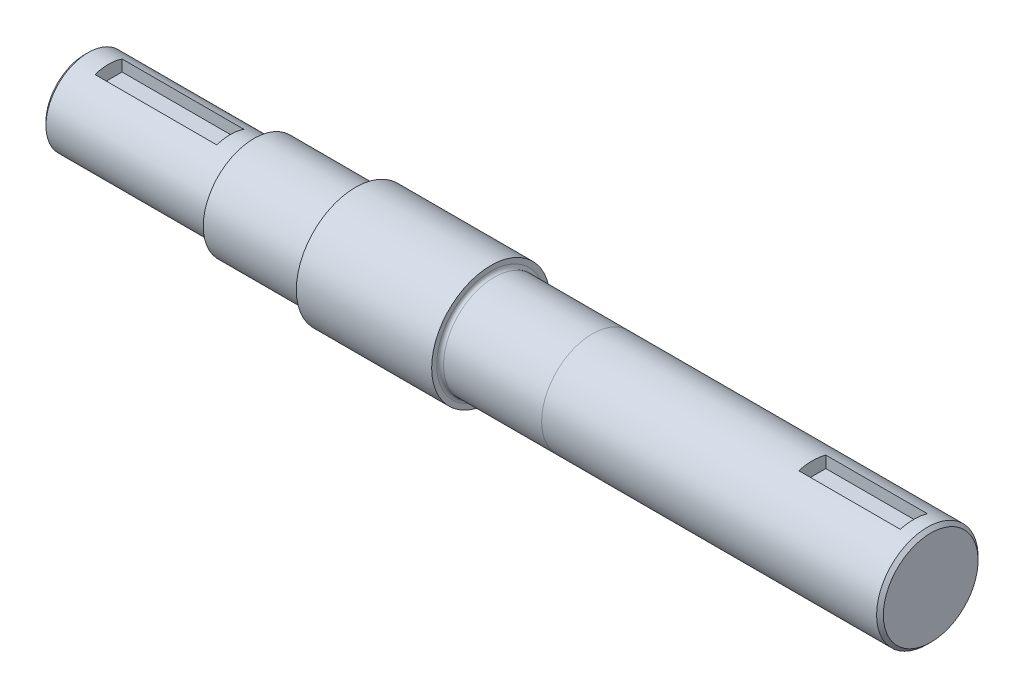
ISO-10303-21;
HEADER;
FILE_DESCRIPTION(('STEP AP214'),'2;1');
FILE_NAME('part.step','',(''),(''),'','','');
FILE_SCHEMA(('AUTOMOTIVE_DESIGN { 1 0 10303 214 1 1 1 1 }'));
ENDSEC;
DATA;
#1=APPLICATION_CONTEXT('core data for automotive mechanical design processes');
#2=APPLICATION_PROTOCOL_DEFINITION('international standard','automotive_design',2000,#1);
#3=PRODUCT_CONTEXT('',#1,'mechanical');
#4=PRODUCT('Part','Part','',(#3));
#5=PRODUCT_RELATED_PRODUCT_CATEGORY('part','',(#4));
#6=PRODUCT_DEFINITION_FORMATION('','',#4);
#7=PRODUCT_DEFINITION_CONTEXT('part definition',#1,'design');
#8=PRODUCT_DEFINITION('design','',#6,#7);
#9=PRODUCT_DEFINITION_SHAPE('','',#8);
#10=(LENGTH_UNIT() NAMED_UNIT(*) SI_UNIT(.MILLI.,.METRE.));
#11=(NAMED_UNIT(*) PLANE_ANGLE_UNIT() SI_UNIT($,.RADIAN.));
#12=(NAMED_UNIT(*) SI_UNIT($,.STERADIAN.) SOLID_ANGLE_UNIT());
#13=UNCERTAINTY_MEASURE_WITH_UNIT(LENGTH_MEASURE(1.E-05),#10,'distance_accuracy_value','');
#14=(GEOMETRIC_REPRESENTATION_CONTEXT(3) GLOBAL_UNCERTAINTY_ASSIGNED_CONTEXT((#13)) GLOBAL_UNIT_ASSIGNED_CONTEXT((#10,
#11,#12)) REPRESENTATION_CONTEXT('',''));
#15=CARTESIAN_POINT('',(0.,0.,0.));
#16=DIRECTION('',(0.,0.,1.));
#17=DIRECTION('',(1.,0.,0.));
#18=AXIS2_PLACEMENT_3D('',#15,#16,#17);
#19=CARTESIAN_POINT('',(0.,0.,0.));
#20=DIRECTION('',(-1.,0.,0.));
#21=DIRECTION('',(0.,0.,1.));
#22=AXIS2_PLACEMENT_3D('',#19,#20,#21);
#23=CYLINDRICAL_SURFACE('',#22,15.);
#24=CARTESIAN_POINT('',(245.,0.,0.));
#25=DIRECTION('',(-1.,0.,0.));
#26=DIRECTION('',(0.,0.,1.));
#27=AXIS2_PLACEMENT_3D('',#24,#25,#26);
#28=CIRCLE('',#27,15.);
#29=CARTESIAN_POINT('',(245.,14.456832294801,4.));
#30=VERTEX_POINT('',#29);
#31=CARTESIAN_POINT('',(245.,14.456832294801,-4.));
#32=VERTEX_POINT('',#31);
#33=EDGE_CURVE('E116',#30,#32,#28,.T.);
#34=ORIENTED_EDGE('',*,*,#33,.F.);
#35=DIRECTION('',(-1.,0.,0.));
#36=VECTOR('',#35,1.);
#37=CARTESIAN_POINT('',(0.,14.456832294801,4.00000000000001));
#38=LINE('',#37,#36);
#39=CARTESIAN_POINT('',(215.,14.456832294801,4.00000000000001));
#40=VERTEX_POINT('',#39);
#41=EDGE_CURVE('E180',#40,#30,#38,.F.);
#42=ORIENTED_EDGE('',*,*,#41,.F.);
#43=CARTESIAN_POINT('',(215.,0.,0.));
#44=DIRECTION('',(1.,0.,0.));
#45=DIRECTION('',(0.,0.,-1.));
#46=AXIS2_PLACEMENT_3D('',#43,#44,#45);
#47=CIRCLE('',#46,15.);
#48=CARTESIAN_POINT('',(215.,14.456832294801,-4.));
#49=VERTEX_POINT('',#48);
#50=EDGE_CURVE('E182',#49,#40,#47,.T.);
#51=ORIENTED_EDGE('',*,*,#50,.F.);
#52=DIRECTION('',(-1.,0.,0.));
#53=VECTOR('',#52,1.);
#54=CARTESIAN_POINT('',(0.,14.456832294801,-4.00000000000002));
#55=LINE('',#54,#53);
#56=EDGE_CURVE('E181',#32,#49,#55,.T.);
#57=ORIENTED_EDGE('',*,*,#56,.F.);
#58=EDGE_LOOP('',(#34,#42,#51,#57));
#59=FACE_BOUND('',#58,.T.);
#60=CARTESIAN_POINT('',(249.,0.,0.));
#61=DIRECTION('',(-1.,0.,0.));
#62=DIRECTION('',(0.,0.,1.));
#63=AXIS2_PLACEMENT_3D('',#60,#61,#62);
#64=CIRCLE('',#63,15.);
#65=CARTESIAN_POINT('',(249.,0.,15.));
#66=VERTEX_POINT('',#65);
#67=EDGE_CURVE('E209',#66,#66,#64,.T.);
#68=ORIENTED_EDGE('',*,*,#67,.T.);
#69=EDGE_LOOP('',(#68));
#70=FACE_BOUND('',#69,.T.);
#71=CARTESIAN_POINT('',(150.,0.,0.));
#72=DIRECTION('',(1.,0.,0.));
#73=DIRECTION('',(0.,0.,-1.));
#74=AXIS2_PLACEMENT_3D('',#71,#72,#73);
#75=CIRCLE('',#74,15.);
#76=CARTESIAN_POINT('',(150.,0.,-15.));
#77=VERTEX_POINT('',#76);
#78=EDGE_CURVE('E12',#77,#77,#75,.T.);
#79=ORIENTED_EDGE('',*,*,#78,.T.);
#80=EDGE_LOOP('',(#79));
#81=FACE_BOUND('',#80,.T.);
#82=ADVANCED_FACE('F42',(#59,#70,#81),#23,.T.);
#83=ORIENTED_EDGE('',*,*,#78,.F.);
#84=EDGE_LOOP('',(#83));
#85=FACE_BOUND('',#84,.T.);
#86=CARTESIAN_POINT('',(121.,0.,0.));
#87=DIRECTION('',(-1.,0.,0.));
#88=DIRECTION('',(0.,0.,1.));
#89=AXIS2_PLACEMENT_3D('',#86,#87,#88);
#90=CIRCLE('',#89,15.);
#91=CARTESIAN_POINT('',(121.,0.,15.));
#92=VERTEX_POINT('',#91);
#93=EDGE_CURVE('E188',#92,#92,#90,.F.);
#94=ORIENTED_EDGE('',*,*,#93,.T.);
#95=EDGE_LOOP('',(#94));
#96=FACE_BOUND('',#95,.T.);
#97=ADVANCED_FACE('F221',(#85,#96),#23,.T.);
#98=CARTESIAN_POINT('',(0.,0.,0.));
#99=DIRECTION('',(-1.,0.,0.));
#100=DIRECTION('',(0.,0.,1.));
#101=AXIS2_PLACEMENT_3D('',#98,#99,#100);
#102=CYLINDRICAL_SURFACE('',#101,12.5);
#103=CARTESIAN_POINT('',(1.00000000000006,0.,0.));
#104=DIRECTION('',(1.,0.,0.));
#105=DIRECTION('',(0.,0.,-1.));
#106=AXIS2_PLACEMENT_3D('',#103,#104,#105);
#107=CIRCLE('',#106,12.5);
#108=CARTESIAN_POINT('',(1.00000000000006,0.,-12.5));
#109=VERTEX_POINT('',#108);
#110=EDGE_CURVE('E210',#109,#109,#107,.T.);
#111=ORIENTED_EDGE('',*,*,#110,.T.);
#112=EDGE_LOOP('',(#111));
#113=FACE_BOUND('',#112,.T.);
#114=CARTESIAN_POINT('',(49.,0.,0.));
#115=DIRECTION('',(1.,0.,0.));
#116=DIRECTION('',(0.,0.,-1.));
#117=AXIS2_PLACEMENT_3D('',#114,#115,#116);
#118=CIRCLE('',#117,12.5);
#119=CARTESIAN_POINT('',(49.,0.,-12.5));
#120=VERTEX_POINT('',#119);
#121=EDGE_CURVE('E196',#120,#120,#118,.F.);
#122=ORIENTED_EDGE('',*,*,#121,.T.);
#123=EDGE_LOOP('',(#122));
#124=FACE_BOUND('',#123,.T.);
#125=CARTESIAN_POINT('',(7.,0.,0.));
#126=DIRECTION('',(1.,0.,0.));
#127=DIRECTION('',(0.,0.,-1.));
#128=AXIS2_PLACEMENT_3D('',#125,#126,#127);
#129=CIRCLE('',#128,12.5);
#130=CARTESIAN_POINT('',(7.,11.842719282327,-4.));
#131=VERTEX_POINT('',#130);
#132=CARTESIAN_POINT('',(7.,11.842719282327,4.));
#133=VERTEX_POINT('',#132);
#134=EDGE_CURVE('E179',#131,#133,#129,.T.);
#135=ORIENTED_EDGE('',*,*,#134,.F.);
#136=DIRECTION('',(-1.,0.,0.));
#137=VECTOR('',#136,1.);
#138=CARTESIAN_POINT('',(0.,11.842719282327,-4.));
#139=LINE('',#138,#137);
#140=CARTESIAN_POINT('',(43.,11.842719282327,-4.));
#141=VERTEX_POINT('',#140);
#142=EDGE_CURVE('E166',#131,#141,#139,.F.);
#143=ORIENTED_EDGE('',*,*,#142,.T.);
#144=CARTESIAN_POINT('',(43.,0.,0.));
#145=DIRECTION('',(1.,0.,0.));
#146=DIRECTION('',(0.,0.,-1.));
#147=AXIS2_PLACEMENT_3D('',#144,#145,#146);
#148=CIRCLE('',#147,12.5);
#149=CARTESIAN_POINT('',(43.,11.842719282327,4.));
#150=VERTEX_POINT('',#149);
#151=EDGE_CURVE('E171',#141,#150,#148,.T.);
#152=ORIENTED_EDGE('',*,*,#151,.T.);
#153=DIRECTION('',(-1.,0.,0.));
#154=VECTOR('',#153,1.);
#155=CARTESIAN_POINT('',(0.,11.842719282327,4.));
#156=LINE('',#155,#154);
#157=EDGE_CURVE('E172',#133,#150,#156,.F.);
#158=ORIENTED_EDGE('',*,*,#157,.F.);
#159=EDGE_LOOP('',(#135,#143,#152,#158));
#160=FACE_BOUND('',#159,.T.);
#161=ADVANCED_FACE('F233',(#113,#124,#160),#102,.T.);
#162=CARTESIAN_POINT('',(0.,0.,0.));
#163=DIRECTION('',(1.,0.,0.));
#164=DIRECTION('',(0.,0.,-1.));
#165=AXIS2_PLACEMENT_3D('',#162,#163,#164);
#166=PLANE('',#165);
#167=CARTESIAN_POINT('',(0.,0.,0.));
#168=DIRECTION('',(1.,0.,0.));
#169=DIRECTION('',(0.,0.,-1.));
#170=AXIS2_PLACEMENT_3D('',#167,#168,#169);
#171=CIRCLE('',#170,11.5);
#172=CARTESIAN_POINT('',(0.,0.,-11.5));
#173=VERTEX_POINT('',#172);
#174=EDGE_CURVE('E204',#173,#173,#171,.F.);
#175=ORIENTED_EDGE('',*,*,#174,.T.);
#176=EDGE_LOOP('',(#175));
#177=FACE_BOUND('',#176,.T.);
#178=ADVANCED_FACE('F270',(#177),#166,.F.);
#179=CARTESIAN_POINT('',(50.,12.5,0.));
#180=DIRECTION('',(1.,0.,0.));
#181=DIRECTION('',(0.,0.,-1.));
#182=AXIS2_PLACEMENT_3D('',#179,#180,#181);
#183=PLANE('',#182);
#184=CARTESIAN_POINT('',(50.,0.,0.));
#185=DIRECTION('',(1.,0.,0.));
#186=DIRECTION('',(0.,0.,-1.));
#187=AXIS2_PLACEMENT_3D('',#184,#185,#186);
#188=CIRCLE('',#187,13.5);
#189=CARTESIAN_POINT('',(50.,0.,-13.5));
#190=VERTEX_POINT('',#189);
#191=EDGE_CURVE('E203',#190,#190,#188,.T.);
#192=ORIENTED_EDGE('',*,*,#191,.T.);
#193=EDGE_LOOP('',(#192));
#194=FACE_BOUND('',#193,.T.);
#195=CARTESIAN_POINT('',(50.,0.,0.));
#196=DIRECTION('',(-1.,0.,0.));
#197=DIRECTION('',(0.,0.,1.));
#198=AXIS2_PLACEMENT_3D('',#195,#196,#197);
#199=CIRCLE('',#198,15.);
#200=CARTESIAN_POINT('',(50.,0.,15.));
#201=VERTEX_POINT('',#200);
#202=EDGE_CURVE('E167',#201,#201,#199,.T.);
#203=ORIENTED_EDGE('',*,*,#202,.T.);
#204=EDGE_LOOP('',(#203));
#205=FACE_BOUND('',#204,.T.);
#206=ADVANCED_FACE('F263',(#194,#205),#183,.F.);
#207=CARTESIAN_POINT('',(0.,0.,0.));
#208=DIRECTION('',(-1.,0.,0.));
#209=DIRECTION('',(0.,0.,1.));
#210=AXIS2_PLACEMENT_3D('',#207,#208,#209);
#211=CYLINDRICAL_SURFACE('',#210,15.);
#212=CARTESIAN_POINT('',(79.,0.,0.));
#213=DIRECTION('',(1.,0.,0.));
#214=DIRECTION('',(0.,0.,-1.));
#215=AXIS2_PLACEMENT_3D('',#212,#213,#214);
#216=CIRCLE('',#215,15.);
#217=CARTESIAN_POINT('',(79.,0.,-15.));
#218=VERTEX_POINT('',#217);
#219=EDGE_CURVE('E194',#218,#218,#216,.F.);
#220=ORIENTED_EDGE('',*,*,#219,.T.);
#221=EDGE_LOOP('',(#220));
#222=FACE_BOUND('',#221,.T.);
#223=ORIENTED_EDGE('',*,*,#202,.F.);
#224=EDGE_LOOP('',(#223));
#225=FACE_BOUND('',#224,.T.);
#226=ADVANCED_FACE('F258',(#222,#225),#211,.T.);
#227=CARTESIAN_POINT('',(80.,15.,0.));
#228=DIRECTION('',(1.,0.,0.));
#229=DIRECTION('',(0.,0.,-1.));
#230=AXIS2_PLACEMENT_3D('',#227,#228,#229);
#231=PLANE('',#230);
#232=CARTESIAN_POINT('',(80.,0.,0.));
#233=DIRECTION('',(1.,0.,0.));
#234=DIRECTION('',(0.,0.,-1.));
#235=AXIS2_PLACEMENT_3D('',#232,#233,#234);
#236=CIRCLE('',#235,16.);
#237=CARTESIAN_POINT('',(80.,0.,-16.));
#238=VERTEX_POINT('',#237);
#239=EDGE_CURVE('E191',#238,#238,#236,.T.);
#240=ORIENTED_EDGE('',*,*,#239,.T.);
#241=EDGE_LOOP('',(#240));
#242=FACE_BOUND('',#241,.T.);
#243=CARTESIAN_POINT('',(80.,0.,0.));
#244=DIRECTION('',(-1.,0.,0.));
#245=DIRECTION('',(0.,0.,1.));
#246=AXIS2_PLACEMENT_3D('',#243,#244,#245);
#247=CIRCLE('',#246,17.5);
#248=CARTESIAN_POINT('',(80.,0.,17.5));
#249=VERTEX_POINT('',#248);
#250=EDGE_CURVE('E162',#249,#249,#247,.T.);
#251=ORIENTED_EDGE('',*,*,#250,.T.);
#252=EDGE_LOOP('',(#251));
#253=FACE_BOUND('',#252,.T.);
#254=ADVANCED_FACE('F250',(#242,#253),#231,.F.);
#255=CARTESIAN_POINT('',(0.,0.,0.));
#256=DIRECTION('',(-1.,0.,0.));
#257=DIRECTION('',(0.,0.,1.));
#258=AXIS2_PLACEMENT_3D('',#255,#256,#257);
#259=CYLINDRICAL_SURFACE('',#258,17.5);
#260=ORIENTED_EDGE('',*,*,#250,.F.);
#261=EDGE_LOOP('',(#260));
#262=FACE_BOUND('',#261,.T.);
#263=CARTESIAN_POINT('',(120.,0.,0.));
#264=DIRECTION('',(-1.,0.,0.));
#265=DIRECTION('',(0.,0.,1.));
#266=AXIS2_PLACEMENT_3D('',#263,#264,#265);
#267=CIRCLE('',#266,17.5);
#268=CARTESIAN_POINT('',(120.,0.,17.5));
#269=VERTEX_POINT('',#268);
#270=EDGE_CURVE('E159',#269,#269,#267,.T.);
#271=ORIENTED_EDGE('',*,*,#270,.T.);
#272=EDGE_LOOP('',(#271));
#273=FACE_BOUND('',#272,.T.);
#274=ADVANCED_FACE('F243',(#262,#273),#259,.T.);
#275=CARTESIAN_POINT('',(120.,17.5,0.));
#276=DIRECTION('',(-1.,0.,0.));
#277=DIRECTION('',(0.,0.,1.));
#278=AXIS2_PLACEMENT_3D('',#275,#276,#277);
#279=PLANE('',#278);
#280=CARTESIAN_POINT('',(120.,0.,0.));
#281=DIRECTION('',(-1.,0.,0.));
#282=DIRECTION('',(0.,0.,1.));
#283=AXIS2_PLACEMENT_3D('',#280,#281,#282);
#284=CIRCLE('',#283,16.);
#285=CARTESIAN_POINT('',(120.,0.,16.));
#286=VERTEX_POINT('',#285);
#287=EDGE_CURVE('E189',#286,#286,#284,.T.);
#288=ORIENTED_EDGE('',*,*,#287,.T.);
#289=EDGE_LOOP('',(#288));
#290=FACE_BOUND('',#289,.T.);
#291=ORIENTED_EDGE('',*,*,#270,.F.);
#292=EDGE_LOOP('',(#291));
#293=FACE_BOUND('',#292,.T.);
#294=ADVANCED_FACE('F244',(#290,#293),#279,.F.);
#295=CARTESIAN_POINT('',(250.,15.,0.));
#296=DIRECTION('',(-1.,0.,0.));
#297=DIRECTION('',(0.,0.,1.));
#298=AXIS2_PLACEMENT_3D('',#295,#296,#297);
#299=PLANE('',#298);
#300=CARTESIAN_POINT('',(250.,0.,0.));
#301=DIRECTION('',(-1.,0.,0.));
#302=DIRECTION('',(0.,0.,1.));
#303=AXIS2_PLACEMENT_3D('',#300,#301,#302);
#304=CIRCLE('',#303,14.);
#305=CARTESIAN_POINT('',(250.,0.,14.));
#306=VERTEX_POINT('',#305);
#307=EDGE_CURVE('E52',#306,#306,#304,.F.);
#308=ORIENTED_EDGE('',*,*,#307,.T.);
#309=EDGE_LOOP('',(#308));
#310=FACE_BOUND('',#309,.T.);
#311=ADVANCED_FACE('F214',(#310),#299,.F.);
#312=CARTESIAN_POINT('',(7.,17.5,-4.));
#313=DIRECTION('',(1.,0.,0.));
#314=DIRECTION('',(0.,0.,-1.));
#315=AXIS2_PLACEMENT_3D('',#312,#313,#314);
#316=PLANE('',#315);
#317=ORIENTED_EDGE('',*,*,#134,.T.);
#318=DIRECTION('',(0.,-1.,0.));
#319=VECTOR('',#318,1.);
#320=CARTESIAN_POINT('',(7.,17.5,4.));
#321=LINE('',#320,#319);
#322=CARTESIAN_POINT('',(7.,8.5,4.));
#323=VERTEX_POINT('',#322);
#324=EDGE_CURVE('E158',#133,#323,#321,.T.);
#325=ORIENTED_EDGE('',*,*,#324,.T.);
#326=DIRECTION('',(0.,0.,1.));
#327=VECTOR('',#326,1.);
#328=CARTESIAN_POINT('',(7.,8.5,-4.));
#329=LINE('',#328,#327);
#330=CARTESIAN_POINT('',(7.,8.5,-4.));
#331=VERTEX_POINT('',#330);
#332=EDGE_CURVE('E117',#331,#323,#329,.T.);
#333=ORIENTED_EDGE('',*,*,#332,.F.);
#334=DIRECTION('',(0.,-1.,0.));
#335=VECTOR('',#334,1.);
#336=CARTESIAN_POINT('',(7.,17.5,-4.));
#337=LINE('',#336,#335);
#338=EDGE_CURVE('E153',#131,#331,#337,.T.);
#339=ORIENTED_EDGE('',*,*,#338,.F.);
#340=EDGE_LOOP('',(#317,#325,#333,#339));
#341=FACE_BOUND('',#340,.T.);
#342=ADVANCED_FACE('F297',(#341),#316,.T.);
#343=CARTESIAN_POINT('',(7.,17.5,4.));
#344=DIRECTION('',(0.,0.,-1.));
#345=DIRECTION('',(-1.,0.,0.));
#346=AXIS2_PLACEMENT_3D('',#343,#344,#345);
#347=PLANE('',#346);
#348=ORIENTED_EDGE('',*,*,#157,.T.);
#349=DIRECTION('',(0.,-1.,0.));
#350=VECTOR('',#349,1.);
#351=CARTESIAN_POINT('',(43.,17.5,4.));
#352=LINE('',#351,#350);
#353=CARTESIAN_POINT('',(43.,8.5,4.));
#354=VERTEX_POINT('',#353);
#355=EDGE_CURVE('E156',#150,#354,#352,.T.);
#356=ORIENTED_EDGE('',*,*,#355,.T.);
#357=DIRECTION('',(1.,0.,0.));
#358=VECTOR('',#357,1.);
#359=CARTESIAN_POINT('',(7.,8.5,4.));
#360=LINE('',#359,#358);
#361=EDGE_CURVE('E144',#323,#354,#360,.T.);
#362=ORIENTED_EDGE('',*,*,#361,.F.);
#363=ORIENTED_EDGE('',*,*,#324,.F.);
#364=EDGE_LOOP('',(#348,#356,#362,#363));
#365=FACE_BOUND('',#364,.T.);
#366=ADVANCED_FACE('F305',(#365),#347,.T.);
#367=CARTESIAN_POINT('',(43.,17.5,-4.));
#368=DIRECTION('',(1.,0.,0.));
#369=DIRECTION('',(0.,0.,-1.));
#370=AXIS2_PLACEMENT_3D('',#367,#368,#369);
#371=PLANE('',#370);
#372=DIRECTION('',(0.,-1.,0.));
#373=VECTOR('',#372,1.);
#374=CARTESIAN_POINT('',(43.,17.5,-4.));
#375=LINE('',#374,#373);
#376=CARTESIAN_POINT('',(43.,8.5,-4.));
#377=VERTEX_POINT('',#376);
#378=EDGE_CURVE('E67',#141,#377,#375,.T.);
#379=ORIENTED_EDGE('',*,*,#378,.T.);
#380=DIRECTION('',(0.,0.,1.));
#381=VECTOR('',#380,1.);
#382=CARTESIAN_POINT('',(43.,8.5,-4.));
#383=LINE('',#382,#381);
#384=EDGE_CURVE('E146',#377,#354,#383,.T.);
#385=ORIENTED_EDGE('',*,*,#384,.T.);
#386=ORIENTED_EDGE('',*,*,#355,.F.);
#387=ORIENTED_EDGE('',*,*,#151,.F.);
#388=EDGE_LOOP('',(#379,#385,#386,#387));
#389=FACE_BOUND('',#388,.T.);
#390=ADVANCED_FACE('F315',(#389),#371,.F.);
#391=CARTESIAN_POINT('',(7.,17.5,-4.));
#392=DIRECTION('',(0.,0.,-1.));
#393=DIRECTION('',(-1.,0.,0.));
#394=AXIS2_PLACEMENT_3D('',#391,#392,#393);
#395=PLANE('',#394);
#396=ORIENTED_EDGE('',*,*,#338,.T.);
#397=DIRECTION('',(1.,0.,0.));
#398=VECTOR('',#397,1.);
#399=CARTESIAN_POINT('',(7.,8.5,-4.));
#400=LINE('',#399,#398);
#401=EDGE_CURVE('E151',#331,#377,#400,.T.);
#402=ORIENTED_EDGE('',*,*,#401,.T.);
#403=ORIENTED_EDGE('',*,*,#378,.F.);
#404=ORIENTED_EDGE('',*,*,#142,.F.);
#405=EDGE_LOOP('',(#396,#402,#403,#404));
#406=FACE_BOUND('',#405,.T.);
#407=ADVANCED_FACE('F309',(#406),#395,.F.);
#408=CARTESIAN_POINT('',(0.,8.5,0.));
#409=DIRECTION('',(0.,1.,0.));
#410=DIRECTION('',(0.,0.,1.));
#411=AXIS2_PLACEMENT_3D('',#408,#409,#410);
#412=PLANE('',#411);
#413=ORIENTED_EDGE('',*,*,#332,.T.);
#414=ORIENTED_EDGE('',*,*,#361,.T.);
#415=ORIENTED_EDGE('',*,*,#384,.F.);
#416=ORIENTED_EDGE('',*,*,#401,.F.);
#417=EDGE_LOOP('',(#413,#414,#415,#416));
#418=FACE_BOUND('',#417,.T.);
#419=ADVANCED_FACE('F310',(#418),#412,.T.);
#420=CARTESIAN_POINT('',(245.,17.5,-4.));
#421=DIRECTION('',(-1.,0.,0.));
#422=DIRECTION('',(0.,0.,1.));
#423=AXIS2_PLACEMENT_3D('',#420,#421,#422);
#424=PLANE('',#423);
#425=ORIENTED_EDGE('',*,*,#33,.T.);
#426=DIRECTION('',(0.,-1.,0.));
#427=VECTOR('',#426,1.);
#428=CARTESIAN_POINT('',(245.,17.5,-4.));
#429=LINE('',#428,#427);
#430=CARTESIAN_POINT('',(245.,11.,-4.));
#431=VERTEX_POINT('',#430);
#432=EDGE_CURVE('E109',#32,#431,#429,.T.);
#433=ORIENTED_EDGE('',*,*,#432,.T.);
#434=DIRECTION('',(0.,0.,-1.));
#435=VECTOR('',#434,1.);
#436=CARTESIAN_POINT('',(245.,11.,-4.));
#437=LINE('',#436,#435);
#438=CARTESIAN_POINT('',(245.,11.,4.));
#439=VERTEX_POINT('',#438);
#440=EDGE_CURVE('E113',#439,#431,#437,.T.);
#441=ORIENTED_EDGE('',*,*,#440,.F.);
#442=DIRECTION('',(0.,-1.,0.));
#443=VECTOR('',#442,1.);
#444=CARTESIAN_POINT('',(245.,17.5,4.));
#445=LINE('',#444,#443);
#446=EDGE_CURVE('E140',#30,#439,#445,.T.);
#447=ORIENTED_EDGE('',*,*,#446,.F.);
#448=EDGE_LOOP('',(#425,#433,#441,#447));
#449=FACE_BOUND('',#448,.T.);
#450=ADVANCED_FACE('F115',(#449),#424,.T.);
#451=CARTESIAN_POINT('',(245.,17.5,-4.));
#452=DIRECTION('',(0.,0.,1.));
#453=DIRECTION('',(1.,0.,0.));
#454=AXIS2_PLACEMENT_3D('',#451,#452,#453);
#455=PLANE('',#454);
#456=ORIENTED_EDGE('',*,*,#56,.T.);
#457=DIRECTION('',(0.,-1.,0.));
#458=VECTOR('',#457,1.);
#459=CARTESIAN_POINT('',(215.,17.5,-4.));
#460=LINE('',#459,#458);
#461=CARTESIAN_POINT('',(215.,11.,-4.));
#462=VERTEX_POINT('',#461);
#463=EDGE_CURVE('E123',#49,#462,#460,.T.);
#464=ORIENTED_EDGE('',*,*,#463,.T.);
#465=DIRECTION('',(-1.,0.,0.));
#466=VECTOR('',#465,1.);
#467=CARTESIAN_POINT('',(245.,11.,-4.));
#468=LINE('',#467,#466);
#469=EDGE_CURVE('E125',#431,#462,#468,.T.);
#470=ORIENTED_EDGE('',*,*,#469,.F.);
#471=ORIENTED_EDGE('',*,*,#432,.F.);
#472=EDGE_LOOP('',(#456,#464,#470,#471));
#473=FACE_BOUND('',#472,.T.);
#474=ADVANCED_FACE('F121',(#473),#455,.T.);
#475=CARTESIAN_POINT('',(215.,17.5,-4.));
#476=DIRECTION('',(1.,0.,0.));
#477=DIRECTION('',(0.,0.,-1.));
#478=AXIS2_PLACEMENT_3D('',#475,#476,#477);
#479=PLANE('',#478);
#480=ORIENTED_EDGE('',*,*,#50,.T.);
#481=DIRECTION('',(0.,-1.,0.));
#482=VECTOR('',#481,1.);
#483=CARTESIAN_POINT('',(215.,17.5,4.));
#484=LINE('',#483,#482);
#485=CARTESIAN_POINT('',(215.,11.,4.));
#486=VERTEX_POINT('',#485);
#487=EDGE_CURVE('E58',#40,#486,#484,.T.);
#488=ORIENTED_EDGE('',*,*,#487,.T.);
#489=DIRECTION('',(0.,0.,1.));
#490=VECTOR('',#489,1.);
#491=CARTESIAN_POINT('',(215.,11.,-4.));
#492=LINE('',#491,#490);
#493=EDGE_CURVE('E128',#462,#486,#492,.T.);
#494=ORIENTED_EDGE('',*,*,#493,.F.);
#495=ORIENTED_EDGE('',*,*,#463,.F.);
#496=EDGE_LOOP('',(#480,#488,#494,#495));
#497=FACE_BOUND('',#496,.T.);
#498=ADVANCED_FACE('F389',(#497),#479,.T.);
#499=CARTESIAN_POINT('',(245.,17.5,4.));
#500=DIRECTION('',(0.,0.,-1.));
#501=DIRECTION('',(-1.,0.,0.));
#502=AXIS2_PLACEMENT_3D('',#499,#500,#501);
#503=PLANE('',#502);
#504=ORIENTED_EDGE('',*,*,#41,.T.);
#505=ORIENTED_EDGE('',*,*,#446,.T.);
#506=DIRECTION('',(1.,0.,0.));
#507=VECTOR('',#506,1.);
#508=CARTESIAN_POINT('',(245.,11.,4.));
#509=LINE('',#508,#507);
#510=EDGE_CURVE('E133',#486,#439,#509,.T.);
#511=ORIENTED_EDGE('',*,*,#510,.F.);
#512=ORIENTED_EDGE('',*,*,#487,.F.);
#513=EDGE_LOOP('',(#504,#505,#511,#512));
#514=FACE_BOUND('',#513,.T.);
#515=ADVANCED_FACE('F379',(#514),#503,.T.);
#516=CARTESIAN_POINT('',(0.,11.,0.));
#517=DIRECTION('',(0.,-1.,0.));
#518=DIRECTION('',(0.,0.,-1.));
#519=AXIS2_PLACEMENT_3D('',#516,#517,#518);
#520=PLANE('',#519);
#521=ORIENTED_EDGE('',*,*,#440,.T.);
#522=ORIENTED_EDGE('',*,*,#469,.T.);
#523=ORIENTED_EDGE('',*,*,#493,.T.);
#524=ORIENTED_EDGE('',*,*,#510,.T.);
#525=EDGE_LOOP('',(#521,#522,#523,#524));
#526=FACE_BOUND('',#525,.T.);
#527=ADVANCED_FACE('F135',(#526),#520,.F.);
#528=CARTESIAN_POINT('',(121.,0.,0.));
#529=DIRECTION('',(-1.,0.,0.));
#530=DIRECTION('',(0.,0.,1.));
#531=AXIS2_PLACEMENT_3D('',#528,#529,#530);
#532=TOROIDAL_SURFACE('',#531,16.,1.);
#533=ORIENTED_EDGE('',*,*,#93,.F.);
#534=EDGE_LOOP('',(#533));
#535=FACE_BOUND('',#534,.T.);
#536=ORIENTED_EDGE('',*,*,#287,.F.);
#537=EDGE_LOOP('',(#536));
#538=FACE_BOUND('',#537,.T.);
#539=ADVANCED_FACE('F235',(#535,#538),#532,.F.);
#540=CARTESIAN_POINT('',(79.,0.,0.));
#541=DIRECTION('',(1.,0.,0.));
#542=DIRECTION('',(0.,0.,-1.));
#543=AXIS2_PLACEMENT_3D('',#540,#541,#542);
#544=TOROIDAL_SURFACE('',#543,16.,1.);
#545=ORIENTED_EDGE('',*,*,#239,.F.);
#546=EDGE_LOOP('',(#545));
#547=FACE_BOUND('',#546,.T.);
#548=ORIENTED_EDGE('',*,*,#219,.F.);
#549=EDGE_LOOP('',(#548));
#550=FACE_BOUND('',#549,.T.);
#551=ADVANCED_FACE('F240',(#547,#550),#544,.F.);
#552=CARTESIAN_POINT('',(49.,0.,0.));
#553=DIRECTION('',(1.,0.,0.));
#554=DIRECTION('',(0.,0.,-1.));
#555=AXIS2_PLACEMENT_3D('',#552,#553,#554);
#556=TOROIDAL_SURFACE('',#555,13.5,1.);
#557=ORIENTED_EDGE('',*,*,#191,.F.);
#558=EDGE_LOOP('',(#557));
#559=FACE_BOUND('',#558,.T.);
#560=ORIENTED_EDGE('',*,*,#121,.F.);
#561=EDGE_LOOP('',(#560));
#562=FACE_BOUND('',#561,.T.);
#563=ADVANCED_FACE('F280',(#559,#562),#556,.F.);
#564=CARTESIAN_POINT('',(0.,0.,0.));
#565=DIRECTION('',(1.,0.,0.));
#566=DIRECTION('',(0.,0.,-1.));
#567=AXIS2_PLACEMENT_3D('',#564,#565,#566);
#568=CONICAL_SURFACE('',#567,11.5,0.785398163397441);
#569=ORIENTED_EDGE('',*,*,#110,.F.);
#570=EDGE_LOOP('',(#569));
#571=FACE_BOUND('',#570,.T.);
#572=ORIENTED_EDGE('',*,*,#174,.F.);
#573=EDGE_LOOP('',(#572));
#574=FACE_BOUND('',#573,.T.);
#575=ADVANCED_FACE('F218',(#571,#574),#568,.T.);
#576=CARTESIAN_POINT('',(249.,0.,0.));
#577=DIRECTION('',(-1.,0.,0.));
#578=DIRECTION('',(0.,0.,1.));
#579=AXIS2_PLACEMENT_3D('',#576,#577,#578);
#580=CONICAL_SURFACE('',#579,15.,0.78539816339747);
#581=ORIENTED_EDGE('',*,*,#307,.F.);
#582=EDGE_LOOP('',(#581));
#583=FACE_BOUND('',#582,.T.);
#584=ORIENTED_EDGE('',*,*,#67,.F.);
#585=EDGE_LOOP('',(#584));
#586=FACE_BOUND('',#585,.T.);
#587=ADVANCED_FACE('F50',(#583,#586),#580,.T.);
#588=CLOSED_SHELL('',(#82,#97,#161,#178,#206,#226,#254,#274,#294,#311,#342,#366,#390,#407,#419,
#450,#474,#498,#515,#527,#539,#551,#563,#575,#587));
#589=MANIFOLD_SOLID_BREP('B2',#588);
#590=ADVANCED_BREP_SHAPE_REPRESENTATION('',(#18,#589),#14);
#591=SHAPE_DEFINITION_REPRESENTATION(#9,#590);
ENDSEC;
END-ISO-10303-21;
